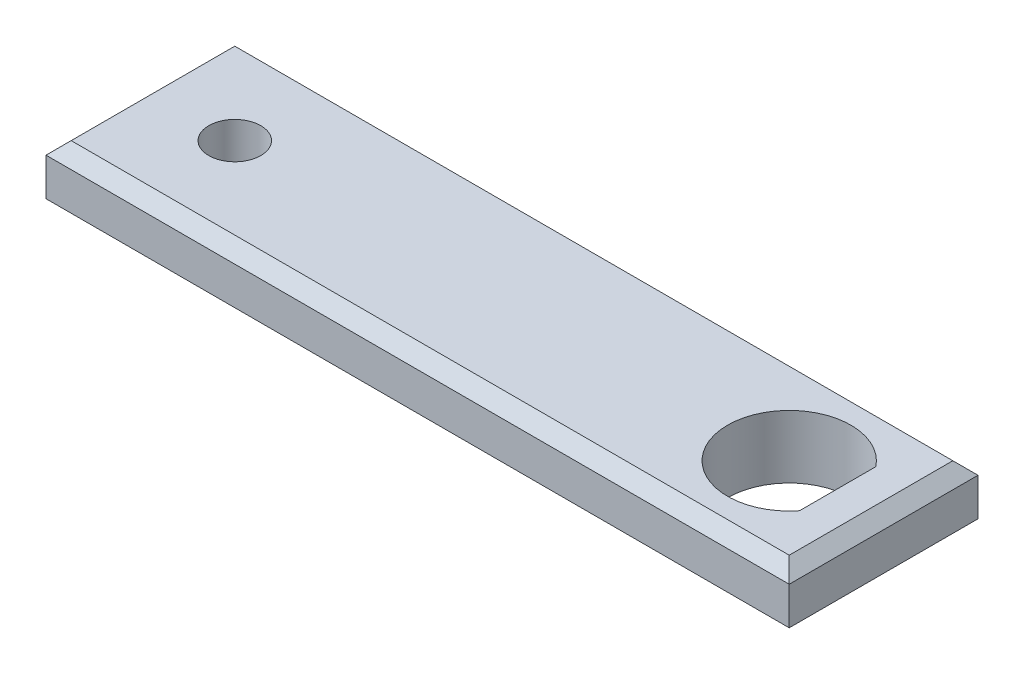
ISO-10303-21;
HEADER;
FILE_DESCRIPTION(('STEP AP214'),'2;1');
FILE_NAME('part.step','',(''),(''),'','','');
FILE_SCHEMA(('AUTOMOTIVE_DESIGN { 1 0 10303 214 1 1 1 1 }'));
ENDSEC;
DATA;
#1=APPLICATION_CONTEXT('core data for automotive mechanical design processes');
#2=APPLICATION_PROTOCOL_DEFINITION('international standard','automotive_design',2000,#1);
#3=PRODUCT_CONTEXT('',#1,'mechanical');
#4=PRODUCT('Part','Part','',(#3));
#5=PRODUCT_RELATED_PRODUCT_CATEGORY('part','',(#4));
#6=PRODUCT_DEFINITION_FORMATION('','',#4);
#7=PRODUCT_DEFINITION_CONTEXT('part definition',#1,'design');
#8=PRODUCT_DEFINITION('design','',#6,#7);
#9=PRODUCT_DEFINITION_SHAPE('','',#8);
#10=(LENGTH_UNIT() NAMED_UNIT(*) SI_UNIT(.MILLI.,.METRE.));
#11=(NAMED_UNIT(*) PLANE_ANGLE_UNIT() SI_UNIT($,.RADIAN.));
#12=(NAMED_UNIT(*) SI_UNIT($,.STERADIAN.) SOLID_ANGLE_UNIT());
#13=UNCERTAINTY_MEASURE_WITH_UNIT(LENGTH_MEASURE(1.E-05),#10,'distance_accuracy_value','');
#14=(GEOMETRIC_REPRESENTATION_CONTEXT(3) GLOBAL_UNCERTAINTY_ASSIGNED_CONTEXT((#13)) GLOBAL_UNIT_ASSIGNED_CONTEXT((#10,
#11,#12)) REPRESENTATION_CONTEXT('',''));
#15=CARTESIAN_POINT('',(0.,0.,0.));
#16=DIRECTION('',(0.,0.,1.));
#17=DIRECTION('',(1.,0.,0.));
#18=AXIS2_PLACEMENT_3D('',#15,#16,#17);
#19=CARTESIAN_POINT('',(0.,0.,19.05));
#20=DIRECTION('',(-1.,0.,0.));
#21=DIRECTION('',(0.,0.,1.));
#22=AXIS2_PLACEMENT_3D('',#19,#20,#21);
#23=PLANE('',#22);
#24=DIRECTION('',(0.,1.,0.));
#25=VECTOR('',#24,1.);
#26=CARTESIAN_POINT('',(0.,0.,0.));
#27=LINE('',#26,#25);
#28=CARTESIAN_POINT('',(0.,1.26999999999999,0.));
#29=VERTEX_POINT('',#28);
#30=CARTESIAN_POINT('',(0.,5.08000000000003,0.));
#31=VERTEX_POINT('',#30);
#32=EDGE_CURVE('E140',#29,#31,#27,.T.);
#33=ORIENTED_EDGE('',*,*,#32,.F.);
#34=DIRECTION('',(0.,0.,1.));
#35=VECTOR('',#34,1.);
#36=CARTESIAN_POINT('',(0.,1.26999999999999,19.05));
#37=LINE('',#36,#35);
#38=CARTESIAN_POINT('',(0.,1.26999999999999,19.05));
#39=VERTEX_POINT('',#38);
#40=EDGE_CURVE('E174',#29,#39,#37,.T.);
#41=ORIENTED_EDGE('',*,*,#40,.T.);
#42=DIRECTION('',(0.,1.,0.));
#43=VECTOR('',#42,1.);
#44=CARTESIAN_POINT('',(0.,0.,19.05));
#45=LINE('',#44,#43);
#46=CARTESIAN_POINT('',(0.,5.08000000000003,19.05));
#47=VERTEX_POINT('',#46);
#48=EDGE_CURVE('E142',#39,#47,#45,.T.);
#49=ORIENTED_EDGE('',*,*,#48,.T.);
#50=DIRECTION('',(0.,0.,-1.));
#51=VECTOR('',#50,1.);
#52=CARTESIAN_POINT('',(0.,5.08000000000003,0.));
#53=LINE('',#52,#51);
#54=EDGE_CURVE('E172',#47,#31,#53,.T.);
#55=ORIENTED_EDGE('',*,*,#54,.T.);
#56=EDGE_LOOP('',(#33,#41,#49,#55));
#57=FACE_BOUND('',#56,.T.);
#58=ADVANCED_FACE('F36',(#57),#23,.T.);
#59=CARTESIAN_POINT('',(0.,0.,19.05));
#60=DIRECTION('',(0.,1.,0.));
#61=DIRECTION('',(0.,0.,1.));
#62=AXIS2_PLACEMENT_3D('',#59,#60,#61);
#63=PLANE('',#62);
#64=DIRECTION('',(1.,0.,0.));
#65=VECTOR('',#64,1.);
#66=CARTESIAN_POINT('',(75.,0.,1.26999999999999));
#67=LINE('',#66,#65);
#68=CARTESIAN_POINT('',(1.26999999999999,0.,1.26999999999999));
#69=VERTEX_POINT('',#68);
#70=CARTESIAN_POINT('',(73.73,0.,1.26999999999999));
#71=VERTEX_POINT('',#70);
#72=EDGE_CURVE('E159',#69,#71,#67,.T.);
#73=ORIENTED_EDGE('',*,*,#72,.T.);
#74=DIRECTION('',(0.,0.,1.));
#75=VECTOR('',#74,1.);
#76=CARTESIAN_POINT('',(73.73,0.,19.05));
#77=LINE('',#76,#75);
#78=CARTESIAN_POINT('',(73.73,0.,17.78));
#79=VERTEX_POINT('',#78);
#80=EDGE_CURVE('E165',#71,#79,#77,.T.);
#81=ORIENTED_EDGE('',*,*,#80,.T.);
#82=DIRECTION('',(-1.,0.,0.));
#83=VECTOR('',#82,1.);
#84=CARTESIAN_POINT('',(0.,0.,17.78));
#85=LINE('',#84,#83);
#86=CARTESIAN_POINT('',(1.26999999999999,0.,17.78));
#87=VERTEX_POINT('',#86);
#88=EDGE_CURVE('E163',#79,#87,#85,.T.);
#89=ORIENTED_EDGE('',*,*,#88,.T.);
#90=DIRECTION('',(0.,0.,-1.));
#91=VECTOR('',#90,1.);
#92=CARTESIAN_POINT('',(1.26999999999999,0.,0.));
#93=LINE('',#92,#91);
#94=EDGE_CURVE('E161',#87,#69,#93,.T.);
#95=ORIENTED_EDGE('',*,*,#94,.T.);
#96=EDGE_LOOP('',(#73,#81,#89,#95));
#97=FACE_BOUND('',#96,.T.);
#98=CARTESIAN_POINT('',(9.525,0.,9.525));
#99=DIRECTION('',(0.,1.,0.));
#100=DIRECTION('',(-1.,0.,0.));
#101=AXIS2_PLACEMENT_3D('',#98,#99,#100);
#102=CIRCLE('',#101,2.62246009401009);
#103=CARTESIAN_POINT('',(6.90253990598991,0.,9.525));
#104=VERTEX_POINT('',#103);
#105=EDGE_CURVE('E138',#104,#104,#102,.T.);
#106=ORIENTED_EDGE('',*,*,#105,.T.);
#107=EDGE_LOOP('',(#106));
#108=FACE_BOUND('',#107,.T.);
#109=DIRECTION('',(0.,0.,1.));
#110=VECTOR('',#109,1.);
#111=CARTESIAN_POINT('',(70.3645,0.,5.67551708017818));
#112=LINE('',#111,#110);
#113=CARTESIAN_POINT('',(70.3645,0.,5.67551708017818));
#114=VERTEX_POINT('',#113);
#115=CARTESIAN_POINT('',(70.3645,0.,13.3744829198218));
#116=VERTEX_POINT('',#115);
#117=EDGE_CURVE('E114',#114,#116,#112,.T.);
#118=ORIENTED_EDGE('',*,*,#117,.F.);
#119=CARTESIAN_POINT('',(65.475,0.,9.525));
#120=DIRECTION('',(0.,1.,0.));
#121=DIRECTION('',(-1.,0.,0.));
#122=AXIS2_PLACEMENT_3D('',#119,#120,#121);
#123=CIRCLE('',#122,6.22300000000001);
#124=EDGE_CURVE('E123',#114,#116,#123,.T.);
#125=ORIENTED_EDGE('',*,*,#124,.T.);
#126=EDGE_LOOP('',(#118,#125));
#127=FACE_BOUND('',#126,.T.);
#128=ADVANCED_FACE('F130',(#97,#108,#127),#63,.F.);
#129=CARTESIAN_POINT('',(75.,6.34999999999999,19.05));
#130=DIRECTION('',(1.,0.,0.));
#131=DIRECTION('',(0.,0.,-1.));
#132=AXIS2_PLACEMENT_3D('',#129,#130,#131);
#133=PLANE('',#132);
#134=DIRECTION('',(0.,-1.,0.));
#135=VECTOR('',#134,1.);
#136=CARTESIAN_POINT('',(75.,6.34999999999999,19.05));
#137=LINE('',#136,#135);
#138=CARTESIAN_POINT('',(75.,5.08,19.05));
#139=VERTEX_POINT('',#138);
#140=CARTESIAN_POINT('',(75.,1.26999999999999,19.05));
#141=VERTEX_POINT('',#140);
#142=EDGE_CURVE('E145',#139,#141,#137,.T.);
#143=ORIENTED_EDGE('',*,*,#142,.T.);
#144=DIRECTION('',(0.,0.,-1.));
#145=VECTOR('',#144,1.);
#146=CARTESIAN_POINT('',(75.,1.26999999999999,0.));
#147=LINE('',#146,#145);
#148=CARTESIAN_POINT('',(75.,1.26999999999999,0.));
#149=VERTEX_POINT('',#148);
#150=EDGE_CURVE('E156',#141,#149,#147,.T.);
#151=ORIENTED_EDGE('',*,*,#150,.T.);
#152=DIRECTION('',(0.,-1.,0.));
#153=VECTOR('',#152,1.);
#154=CARTESIAN_POINT('',(75.,6.34999999999999,0.));
#155=LINE('',#154,#153);
#156=CARTESIAN_POINT('',(75.,5.08,0.));
#157=VERTEX_POINT('',#156);
#158=EDGE_CURVE('E146',#157,#149,#155,.T.);
#159=ORIENTED_EDGE('',*,*,#158,.F.);
#160=DIRECTION('',(0.,0.,1.));
#161=VECTOR('',#160,1.);
#162=CARTESIAN_POINT('',(75.,5.08,19.05));
#163=LINE('',#162,#161);
#164=EDGE_CURVE('E149',#157,#139,#163,.T.);
#165=ORIENTED_EDGE('',*,*,#164,.T.);
#166=EDGE_LOOP('',(#143,#151,#159,#165));
#167=FACE_BOUND('',#166,.T.);
#168=ADVANCED_FACE('F224',(#167),#133,.T.);
#169=CARTESIAN_POINT('',(75.,6.34999999999999,19.05));
#170=DIRECTION('',(0.,-1.,0.));
#171=DIRECTION('',(1.,0.,0.));
#172=AXIS2_PLACEMENT_3D('',#169,#170,#171);
#173=PLANE('',#172);
#174=DIRECTION('',(1.,0.,0.));
#175=VECTOR('',#174,1.);
#176=CARTESIAN_POINT('',(75.,6.34999999999999,17.78));
#177=LINE('',#176,#175);
#178=CARTESIAN_POINT('',(1.27000000000001,6.35000000000001,17.78));
#179=VERTEX_POINT('',#178);
#180=CARTESIAN_POINT('',(73.73,6.34999999999999,17.78));
#181=VERTEX_POINT('',#180);
#182=EDGE_CURVE('E45',#179,#181,#177,.T.);
#183=ORIENTED_EDGE('',*,*,#182,.T.);
#184=DIRECTION('',(0.,0.,-1.));
#185=VECTOR('',#184,1.);
#186=CARTESIAN_POINT('',(73.73,6.34999999999999,0.));
#187=LINE('',#186,#185);
#188=CARTESIAN_POINT('',(73.73,6.34999999999999,1.26999999999999));
#189=VERTEX_POINT('',#188);
#190=EDGE_CURVE('E11',#181,#189,#187,.T.);
#191=ORIENTED_EDGE('',*,*,#190,.T.);
#192=DIRECTION('',(-1.,0.,0.));
#193=VECTOR('',#192,1.);
#194=CARTESIAN_POINT('',(0.,6.35000000000001,1.26999999999999));
#195=LINE('',#194,#193);
#196=CARTESIAN_POINT('',(1.27000000000001,6.35000000000001,1.26999999999999));
#197=VERTEX_POINT('',#196);
#198=EDGE_CURVE('E180',#189,#197,#195,.T.);
#199=ORIENTED_EDGE('',*,*,#198,.T.);
#200=DIRECTION('',(0.,0.,1.));
#201=VECTOR('',#200,1.);
#202=CARTESIAN_POINT('',(1.27000000000001,6.35000000000001,19.05));
#203=LINE('',#202,#201);
#204=EDGE_CURVE('E56',#197,#179,#203,.T.);
#205=ORIENTED_EDGE('',*,*,#204,.T.);
#206=EDGE_LOOP('',(#183,#191,#199,#205));
#207=FACE_BOUND('',#206,.T.);
#208=CARTESIAN_POINT('',(9.525,6.35000000000001,9.525));
#209=DIRECTION('',(0.,1.,0.));
#210=DIRECTION('',(-1.,0.,0.));
#211=AXIS2_PLACEMENT_3D('',#208,#209,#210);
#212=CIRCLE('',#211,2.62246009401009);
#213=CARTESIAN_POINT('',(6.90253990598992,6.35000000000001,9.525));
#214=VERTEX_POINT('',#213);
#215=EDGE_CURVE('E135',#214,#214,#212,.T.);
#216=ORIENTED_EDGE('',*,*,#215,.F.);
#217=EDGE_LOOP('',(#216));
#218=FACE_BOUND('',#217,.T.);
#219=DIRECTION('',(0.,0.,1.));
#220=VECTOR('',#219,1.);
#221=CARTESIAN_POINT('',(70.3645,6.35,5.67551708017818));
#222=LINE('',#221,#220);
#223=CARTESIAN_POINT('',(70.3645,6.35,5.67551708017818));
#224=VERTEX_POINT('',#223);
#225=CARTESIAN_POINT('',(70.3645,6.34999999999999,13.3744829198218));
#226=VERTEX_POINT('',#225);
#227=EDGE_CURVE('E131',#224,#226,#222,.T.);
#228=ORIENTED_EDGE('',*,*,#227,.T.);
#229=CARTESIAN_POINT('',(65.475,6.35000000000001,9.525));
#230=DIRECTION('',(0.,1.,0.));
#231=DIRECTION('',(-1.,0.,0.));
#232=AXIS2_PLACEMENT_3D('',#229,#230,#231);
#233=CIRCLE('',#232,6.22300000000001);
#234=EDGE_CURVE('E128',#224,#226,#233,.T.);
#235=ORIENTED_EDGE('',*,*,#234,.F.);
#236=EDGE_LOOP('',(#228,#235));
#237=FACE_BOUND('',#236,.T.);
#238=ADVANCED_FACE('F260',(#207,#218,#237),#173,.F.);
#239=CARTESIAN_POINT('',(0.,0.,19.05));
#240=DIRECTION('',(0.,0.,-1.));
#241=DIRECTION('',(-1.,0.,0.));
#242=AXIS2_PLACEMENT_3D('',#239,#240,#241);
#243=PLANE('',#242);
#244=ORIENTED_EDGE('',*,*,#48,.F.);
#245=DIRECTION('',(1.,0.,0.));
#246=VECTOR('',#245,1.);
#247=CARTESIAN_POINT('',(0.,1.26999999999999,19.05));
#248=LINE('',#247,#246);
#249=EDGE_CURVE('E170',#39,#141,#248,.T.);
#250=ORIENTED_EDGE('',*,*,#249,.T.);
#251=ORIENTED_EDGE('',*,*,#142,.F.);
#252=DIRECTION('',(-1.,0.,0.));
#253=VECTOR('',#252,1.);
#254=CARTESIAN_POINT('',(0.,5.08000000000003,19.05));
#255=LINE('',#254,#253);
#256=EDGE_CURVE('E168',#139,#47,#255,.T.);
#257=ORIENTED_EDGE('',*,*,#256,.T.);
#258=EDGE_LOOP('',(#244,#250,#251,#257));
#259=FACE_BOUND('',#258,.T.);
#260=ADVANCED_FACE('F240',(#259),#243,.F.);
#261=CARTESIAN_POINT('',(0.,0.,0.));
#262=DIRECTION('',(0.,0.,-1.));
#263=DIRECTION('',(-1.,0.,0.));
#264=AXIS2_PLACEMENT_3D('',#261,#262,#263);
#265=PLANE('',#264);
#266=ORIENTED_EDGE('',*,*,#158,.T.);
#267=DIRECTION('',(-1.,0.,0.));
#268=VECTOR('',#267,1.);
#269=CARTESIAN_POINT('',(0.,1.26999999999999,0.));
#270=LINE('',#269,#268);
#271=EDGE_CURVE('E178',#149,#29,#270,.T.);
#272=ORIENTED_EDGE('',*,*,#271,.T.);
#273=ORIENTED_EDGE('',*,*,#32,.T.);
#274=DIRECTION('',(1.,0.,0.));
#275=VECTOR('',#274,1.);
#276=CARTESIAN_POINT('',(75.,5.08,0.));
#277=LINE('',#276,#275);
#278=EDGE_CURVE('E176',#31,#157,#277,.T.);
#279=ORIENTED_EDGE('',*,*,#278,.T.);
#280=EDGE_LOOP('',(#266,#272,#273,#279));
#281=FACE_BOUND('',#280,.T.);
#282=ADVANCED_FACE('F214',(#281),#265,.T.);
#283=CARTESIAN_POINT('',(65.475,0.,9.525));
#284=DIRECTION('',(0.,1.,0.));
#285=DIRECTION('',(-1.,0.,0.));
#286=AXIS2_PLACEMENT_3D('',#283,#284,#285);
#287=CYLINDRICAL_SURFACE('',#286,6.22300000000001);
#288=ORIENTED_EDGE('',*,*,#234,.T.);
#289=DIRECTION('',(0.,1.,0.));
#290=VECTOR('',#289,1.);
#291=CARTESIAN_POINT('',(70.3645,0.,13.3744829198218));
#292=LINE('',#291,#290);
#293=EDGE_CURVE('E118',#116,#226,#292,.T.);
#294=ORIENTED_EDGE('',*,*,#293,.F.);
#295=ORIENTED_EDGE('',*,*,#124,.F.);
#296=DIRECTION('',(0.,1.,0.));
#297=VECTOR('',#296,1.);
#298=CARTESIAN_POINT('',(70.3645,0.,5.67551708017818));
#299=LINE('',#298,#297);
#300=EDGE_CURVE('E120',#114,#224,#299,.T.);
#301=ORIENTED_EDGE('',*,*,#300,.T.);
#302=EDGE_LOOP('',(#288,#294,#295,#301));
#303=FACE_BOUND('',#302,.T.);
#304=ADVANCED_FACE('F126',(#303),#287,.F.);
#305=CARTESIAN_POINT('',(70.3645,0.,5.67551708017818));
#306=DIRECTION('',(-1.,0.,0.));
#307=DIRECTION('',(0.,-1.,0.));
#308=AXIS2_PLACEMENT_3D('',#305,#306,#307);
#309=PLANE('',#308);
#310=ORIENTED_EDGE('',*,*,#227,.F.);
#311=ORIENTED_EDGE('',*,*,#300,.F.);
#312=ORIENTED_EDGE('',*,*,#117,.T.);
#313=ORIENTED_EDGE('',*,*,#293,.T.);
#314=EDGE_LOOP('',(#310,#311,#312,#313));
#315=FACE_BOUND('',#314,.T.);
#316=ADVANCED_FACE('F117',(#315),#309,.T.);
#317=CARTESIAN_POINT('',(9.525,0.,9.525));
#318=DIRECTION('',(0.,1.,0.));
#319=DIRECTION('',(-1.,0.,0.));
#320=AXIS2_PLACEMENT_3D('',#317,#318,#319);
#321=CYLINDRICAL_SURFACE('',#320,2.62246009401009);
#322=CARTESIAN_POINT('',(6.90253990598991,0.,9.525));
#323=CARTESIAN_POINT('',(6.90253990598991,0.0661458333333244,9.525));
#324=CARTESIAN_POINT('',(6.90253990598991,0.132291666666658,9.525));
#325=CARTESIAN_POINT('',(6.90253990598991,0.264583333333325,9.525));
#326=CARTESIAN_POINT('',(6.90253990598991,0.330729166666659,9.525));
#327=CARTESIAN_POINT('',(6.90253990598991,0.463020833333326,9.525));
#328=CARTESIAN_POINT('',(6.90253990598991,0.529166666666659,9.525));
#329=CARTESIAN_POINT('',(6.90253990598991,0.661458333333326,9.525));
#330=CARTESIAN_POINT('',(6.90253990598991,0.72760416666666,9.525));
#331=CARTESIAN_POINT('',(6.90253990598991,0.859895833333327,9.525));
#332=CARTESIAN_POINT('',(6.90253990598991,0.926041666666661,9.525));
#333=CARTESIAN_POINT('',(6.90253990598991,1.05833333333333,9.525));
#334=CARTESIAN_POINT('',(6.90253990598991,1.12447916666666,9.525));
#335=CARTESIAN_POINT('',(6.90253990598991,1.25677083333333,9.525));
#336=CARTESIAN_POINT('',(6.90253990598991,1.32291666666666,9.525));
#337=CARTESIAN_POINT('',(6.90253990598991,1.45520833333333,9.525));
#338=CARTESIAN_POINT('',(6.90253990598991,1.52135416666666,9.525));
#339=CARTESIAN_POINT('',(6.90253990598991,1.65364583333333,9.525));
#340=CARTESIAN_POINT('',(6.90253990598991,1.71979166666666,9.525));
#341=CARTESIAN_POINT('',(6.90253990598991,1.85208333333333,9.525));
#342=CARTESIAN_POINT('',(6.90253990598991,1.91822916666666,9.525));
#343=CARTESIAN_POINT('',(6.90253990598991,2.05052083333333,9.525));
#344=CARTESIAN_POINT('',(6.90253990598991,2.11666666666666,9.525));
#345=CARTESIAN_POINT('',(6.90253990598991,2.24895833333333,9.525));
#346=CARTESIAN_POINT('',(6.90253990598991,2.31510416666667,9.525));
#347=CARTESIAN_POINT('',(6.90253990598991,2.44739583333333,9.525));
#348=CARTESIAN_POINT('',(6.90253990598991,2.51354166666667,9.525));
#349=CARTESIAN_POINT('',(6.90253990598991,2.64583333333333,9.525));
#350=CARTESIAN_POINT('',(6.90253990598991,2.71197916666667,9.525));
#351=CARTESIAN_POINT('',(6.90253990598991,2.84427083333333,9.525));
#352=CARTESIAN_POINT('',(6.90253990598991,2.91041666666667,9.525));
#353=CARTESIAN_POINT('',(6.90253990598991,3.04270833333334,9.525));
#354=CARTESIAN_POINT('',(6.90253990598991,3.10885416666667,9.525));
#355=CARTESIAN_POINT('',(6.90253990598991,3.24114583333334,9.525));
#356=CARTESIAN_POINT('',(6.90253990598991,3.30729166666667,9.525));
#357=CARTESIAN_POINT('',(6.90253990598991,3.43958333333334,9.525));
#358=CARTESIAN_POINT('',(6.90253990598992,3.50572916666667,9.525));
#359=CARTESIAN_POINT('',(6.90253990598992,3.63802083333334,9.525));
#360=CARTESIAN_POINT('',(6.90253990598992,3.70416666666667,9.525));
#361=CARTESIAN_POINT('',(6.90253990598992,3.83645833333334,9.525));
#362=CARTESIAN_POINT('',(6.90253990598992,3.90260416666667,9.525));
#363=CARTESIAN_POINT('',(6.90253990598992,4.03489583333334,9.525));
#364=CARTESIAN_POINT('',(6.90253990598992,4.10104166666667,9.525));
#365=CARTESIAN_POINT('',(6.90253990598992,4.23333333333334,9.525));
#366=CARTESIAN_POINT('',(6.90253990598992,4.29947916666667,9.525));
#367=CARTESIAN_POINT('',(6.90253990598992,4.43177083333334,9.525));
#368=CARTESIAN_POINT('',(6.90253990598992,4.49791666666667,9.525));
#369=CARTESIAN_POINT('',(6.90253990598992,4.63020833333334,9.525));
#370=CARTESIAN_POINT('',(6.90253990598992,4.69635416666667,9.525));
#371=CARTESIAN_POINT('',(6.90253990598992,4.82864583333334,9.525));
#372=CARTESIAN_POINT('',(6.90253990598992,4.89479166666668,9.525));
#373=CARTESIAN_POINT('',(6.90253990598992,5.02708333333334,9.525));
#374=CARTESIAN_POINT('',(6.90253990598992,5.09322916666668,9.525));
#375=CARTESIAN_POINT('',(6.90253990598992,5.22552083333334,9.525));
#376=CARTESIAN_POINT('',(6.90253990598992,5.29166666666668,9.525));
#377=CARTESIAN_POINT('',(6.90253990598992,5.42395833333334,9.525));
#378=CARTESIAN_POINT('',(6.90253990598992,5.49010416666668,9.525));
#379=CARTESIAN_POINT('',(6.90253990598992,5.62239583333334,9.525));
#380=CARTESIAN_POINT('',(6.90253990598992,5.68854166666668,9.525));
#381=CARTESIAN_POINT('',(6.90253990598992,5.82083333333335,9.525));
#382=CARTESIAN_POINT('',(6.90253990598992,5.88697916666668,9.525));
#383=CARTESIAN_POINT('',(6.90253990598992,6.01927083333335,9.525));
#384=CARTESIAN_POINT('',(6.90253990598992,6.08541666666668,9.525));
#385=CARTESIAN_POINT('',(6.90253990598992,6.21770833333335,9.525));
#386=CARTESIAN_POINT('',(6.90253990598992,6.28385416666668,9.525));
#387=CARTESIAN_POINT('',(6.90253990598992,6.35000000000001,9.525));
#388=B_SPLINE_CURVE_WITH_KNOTS('',3,(#322,#323,#324,#325,#326,#327,#328,#329,#330,#331,#332,
#333,#334,#335,#336,#337,#338,#339,#340,#341,#342,#343,#344,#345,#346,#347,#348,#349,#350,#351,
#352,#353,#354,#355,#356,#357,#358,#359,#360,#361,#362,#363,#364,#365,#366,#367,#368,#369,#370,
#371,#372,#373,#374,#375,#376,#377,#378,#379,#380,#381,#382,#383,#384,#385,#386,#387),
.UNSPECIFIED.,.F.,.F.,(4,2,2,2,2,2,2,2,2,2,2,2,2,2,2,2,2,2,2,2,2,2,2,2,2,2,2,2,2,2,2,2,4),(0.,
0.198437500000001,0.396875000000001,0.595312500000002,0.793750000000003,0.992187500000003,
1.190625,1.38906250000001,1.58750000000001,1.78593750000001,1.98437500000001,2.18281250000001,
2.38125000000001,2.57968750000001,2.77812500000001,2.97656250000001,3.17500000000001,
3.37343750000001,3.57187500000001,3.77031250000001,3.96875000000001,4.16718750000001,
4.36562500000002,4.56406250000002,4.76250000000002,4.96093750000002,5.15937500000002,
5.35781250000002,5.55625000000002,5.75468750000002,5.95312500000002,6.15156250000002,
6.35000000000002),.UNSPECIFIED.);
#389=EDGE_CURVE('BSEAM250',#104,#214,#388,.T.);
#390=ORIENTED_EDGE('',*,*,#105,.F.);
#391=ORIENTED_EDGE('',*,*,#215,.T.);
#392=ORIENTED_EDGE('',*,*,#389,.T.);
#393=ORIENTED_EDGE('',*,*,#389,.F.);
#394=EDGE_LOOP('',(#390,#392,#391,#393));
#395=FACE_BOUND('',#394,.T.);
#396=ADVANCED_FACE('F250',(#395),#321,.F.);
#397=CARTESIAN_POINT('',(1.26999999999999,0.,19.05));
#398=DIRECTION('',(-0.707106781186546,-0.707106781186549,0.));
#399=DIRECTION('',(0.,0.,1.));
#400=AXIS2_PLACEMENT_3D('',#397,#398,#399);
#401=PLANE('',#400);
#402=DIRECTION('',(-0.577350269189627,0.577350269189624,-0.577350269189627));
#403=VECTOR('',#402,1.);
#404=CARTESIAN_POINT('',(0.84666666666666,0.42333333333333,0.846666666666661));
#405=LINE('',#404,#403);
#406=EDGE_CURVE('E188',#69,#29,#405,.T.);
#407=ORIENTED_EDGE('',*,*,#406,.F.);
#408=ORIENTED_EDGE('',*,*,#94,.F.);
#409=DIRECTION('',(0.577350269189627,-0.577350269189624,-0.577350269189627));
#410=VECTOR('',#409,1.);
#411=CARTESIAN_POINT('',(0.84666666666666,0.42333333333333,18.2033333333333));
#412=LINE('',#411,#410);
#413=EDGE_CURVE('E191',#39,#87,#412,.T.);
#414=ORIENTED_EDGE('',*,*,#413,.F.);
#415=ORIENTED_EDGE('',*,*,#40,.F.);
#416=EDGE_LOOP('',(#407,#408,#414,#415));
#417=FACE_BOUND('',#416,.T.);
#418=ADVANCED_FACE('F237',(#417),#401,.T.);
#419=CARTESIAN_POINT('',(0.,1.26999999999999,19.05));
#420=DIRECTION('',(0.,0.70710678118655,-0.707106781186545));
#421=DIRECTION('',(1.,0.,0.));
#422=AXIS2_PLACEMENT_3D('',#419,#420,#421);
#423=PLANE('',#422);
#424=ORIENTED_EDGE('',*,*,#413,.T.);
#425=ORIENTED_EDGE('',*,*,#88,.F.);
#426=DIRECTION('',(-0.577350269189631,-0.577350269189622,-0.577350269189625));
#427=VECTOR('',#426,1.);
#428=CARTESIAN_POINT('',(49.9999999999996,-23.7300000000001,-5.95000000000019));
#429=LINE('',#428,#427);
#430=EDGE_CURVE('E186',#141,#79,#429,.T.);
#431=ORIENTED_EDGE('',*,*,#430,.F.);
#432=ORIENTED_EDGE('',*,*,#249,.F.);
#433=EDGE_LOOP('',(#424,#425,#431,#432));
#434=FACE_BOUND('',#433,.T.);
#435=ADVANCED_FACE('F242',(#434),#423,.F.);
#436=CARTESIAN_POINT('',(0.,0.,1.26999999999999));
#437=DIRECTION('',(0.,-0.70710678118655,-0.707106781186545));
#438=DIRECTION('',(-1.,0.,0.));
#439=AXIS2_PLACEMENT_3D('',#436,#437,#438);
#440=PLANE('',#439);
#441=ORIENTED_EDGE('',*,*,#406,.T.);
#442=ORIENTED_EDGE('',*,*,#271,.F.);
#443=DIRECTION('',(-0.577350269189631,-0.577350269189622,0.577350269189625));
#444=VECTOR('',#443,1.);
#445=CARTESIAN_POINT('',(49.1533333333329,-24.5766666666667,25.8466666666668));
#446=LINE('',#445,#444);
#447=EDGE_CURVE('E184',#71,#149,#446,.F.);
#448=ORIENTED_EDGE('',*,*,#447,.F.);
#449=ORIENTED_EDGE('',*,*,#72,.F.);
#450=EDGE_LOOP('',(#441,#442,#448,#449));
#451=FACE_BOUND('',#450,.T.);
#452=ADVANCED_FACE('F219',(#451),#440,.T.);
#453=CARTESIAN_POINT('',(75.,1.26999999999999,19.05));
#454=DIRECTION('',(0.707106781186542,-0.707106781186553,0.));
#455=DIRECTION('',(0.,0.,1.));
#456=AXIS2_PLACEMENT_3D('',#453,#454,#455);
#457=PLANE('',#456);
#458=ORIENTED_EDGE('',*,*,#430,.T.);
#459=ORIENTED_EDGE('',*,*,#80,.F.);
#460=ORIENTED_EDGE('',*,*,#447,.T.);
#461=ORIENTED_EDGE('',*,*,#150,.F.);
#462=EDGE_LOOP('',(#458,#459,#460,#461));
#463=FACE_BOUND('',#462,.T.);
#464=ADVANCED_FACE('F229',(#463),#457,.T.);
#465=CARTESIAN_POINT('',(0.,5.08000000000003,19.05));
#466=DIRECTION('',(-0.707106781186542,0.707106781186553,0.));
#467=DIRECTION('',(0.,0.,1.));
#468=AXIS2_PLACEMENT_3D('',#465,#466,#467);
#469=PLANE('',#468);
#470=DIRECTION('',(0.577350269189631,0.577350269189622,0.577350269189625));
#471=VECTOR('',#470,1.);
#472=CARTESIAN_POINT('',(25.8466666666671,30.9266666666667,25.8466666666668));
#473=LINE('',#472,#471);
#474=EDGE_CURVE('E197',#31,#197,#473,.T.);
#475=ORIENTED_EDGE('',*,*,#474,.F.);
#476=ORIENTED_EDGE('',*,*,#54,.F.);
#477=DIRECTION('',(-0.577350269189631,-0.577350269189622,0.577350269189625));
#478=VECTOR('',#477,1.);
#479=CARTESIAN_POINT('',(0.,5.08000000000003,19.05));
#480=LINE('',#479,#478);
#481=EDGE_CURVE('E40',#179,#47,#480,.T.);
#482=ORIENTED_EDGE('',*,*,#481,.F.);
#483=ORIENTED_EDGE('',*,*,#204,.F.);
#484=EDGE_LOOP('',(#475,#476,#482,#483));
#485=FACE_BOUND('',#484,.T.);
#486=ADVANCED_FACE('F38',(#485),#469,.T.);
#487=CARTESIAN_POINT('',(0.,5.08000000000003,19.05));
#488=DIRECTION('',(0.,-0.707106781186549,-0.707106781186546));
#489=DIRECTION('',(-1.,0.,0.));
#490=AXIS2_PLACEMENT_3D('',#487,#488,#489);
#491=PLANE('',#490);
#492=ORIENTED_EDGE('',*,*,#481,.T.);
#493=ORIENTED_EDGE('',*,*,#256,.F.);
#494=DIRECTION('',(0.577350269189627,-0.577350269189624,0.577350269189627));
#495=VECTOR('',#494,1.);
#496=CARTESIAN_POINT('',(49.9999999999999,30.08,-5.9500000000001));
#497=LINE('',#496,#495);
#498=EDGE_CURVE('E196',#181,#139,#497,.T.);
#499=ORIENTED_EDGE('',*,*,#498,.F.);
#500=ORIENTED_EDGE('',*,*,#182,.F.);
#501=EDGE_LOOP('',(#492,#493,#499,#500));
#502=FACE_BOUND('',#501,.T.);
#503=ADVANCED_FACE('F206',(#502),#491,.F.);
#504=CARTESIAN_POINT('',(75.,6.34999999999999,1.26999999999999));
#505=DIRECTION('',(0.,0.707106781186549,-0.707106781186546));
#506=DIRECTION('',(1.,0.,0.));
#507=AXIS2_PLACEMENT_3D('',#504,#505,#506);
#508=PLANE('',#507);
#509=ORIENTED_EDGE('',*,*,#474,.T.);
#510=ORIENTED_EDGE('',*,*,#198,.F.);
#511=DIRECTION('',(0.577350269189627,-0.577350269189624,-0.577350269189627));
#512=VECTOR('',#511,1.);
#513=CARTESIAN_POINT('',(74.1533333333333,5.92666666666666,0.84666666666666));
#514=LINE('',#513,#512);
#515=EDGE_CURVE('E194',#157,#189,#514,.F.);
#516=ORIENTED_EDGE('',*,*,#515,.F.);
#517=ORIENTED_EDGE('',*,*,#278,.F.);
#518=EDGE_LOOP('',(#509,#510,#516,#517));
#519=FACE_BOUND('',#518,.T.);
#520=ADVANCED_FACE('F269',(#519),#508,.T.);
#521=CARTESIAN_POINT('',(73.73,6.34999999999999,19.05));
#522=DIRECTION('',(0.707106781186545,0.70710678118655,0.));
#523=DIRECTION('',(0.,0.,1.));
#524=AXIS2_PLACEMENT_3D('',#521,#522,#523);
#525=PLANE('',#524);
#526=ORIENTED_EDGE('',*,*,#498,.T.);
#527=ORIENTED_EDGE('',*,*,#164,.F.);
#528=ORIENTED_EDGE('',*,*,#515,.T.);
#529=ORIENTED_EDGE('',*,*,#190,.F.);
#530=EDGE_LOOP('',(#526,#527,#528,#529));
#531=FACE_BOUND('',#530,.T.);
#532=ADVANCED_FACE('F273',(#531),#525,.T.);
#533=CLOSED_SHELL('',(#58,#128,#168,#238,#260,#282,#304,#316,#396,#418,#435,#452,#464,#486,#503,
#520,#532));
#534=MANIFOLD_SOLID_BREP('B2',#533);
#535=ADVANCED_BREP_SHAPE_REPRESENTATION('',(#18,#534),#14);
#536=SHAPE_DEFINITION_REPRESENTATION(#9,#535);
ENDSEC;
END-ISO-10303-21;
